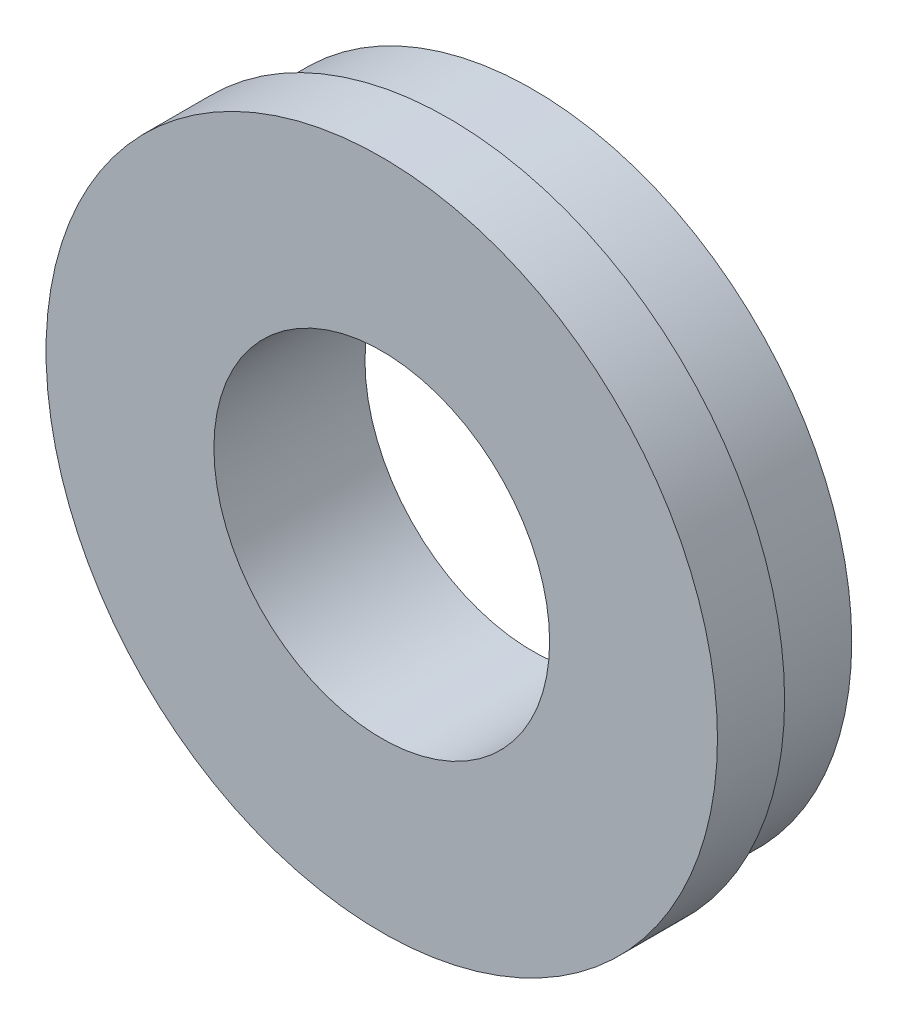
ISO-10303-21;
HEADER;
FILE_DESCRIPTION(('STEP AP214'),'2;1');
FILE_NAME('part.step','',(''),(''),'','','');
FILE_SCHEMA(('AUTOMOTIVE_DESIGN { 1 0 10303 214 1 1 1 1 }'));
ENDSEC;
DATA;
#1=APPLICATION_CONTEXT('core data for automotive mechanical design processes');
#2=APPLICATION_PROTOCOL_DEFINITION('international standard','automotive_design',2000,#1);
#3=PRODUCT_CONTEXT('',#1,'mechanical');
#4=PRODUCT('Part','Part','',(#3));
#5=PRODUCT_RELATED_PRODUCT_CATEGORY('part','',(#4));
#6=PRODUCT_DEFINITION_FORMATION('','',#4);
#7=PRODUCT_DEFINITION_CONTEXT('part definition',#1,'design');
#8=PRODUCT_DEFINITION('design','',#6,#7);
#9=PRODUCT_DEFINITION_SHAPE('','',#8);
#10=(LENGTH_UNIT() NAMED_UNIT(*) SI_UNIT(.MILLI.,.METRE.));
#11=(NAMED_UNIT(*) PLANE_ANGLE_UNIT() SI_UNIT($,.RADIAN.));
#12=(NAMED_UNIT(*) SI_UNIT($,.STERADIAN.) SOLID_ANGLE_UNIT());
#13=UNCERTAINTY_MEASURE_WITH_UNIT(LENGTH_MEASURE(1.E-05),#10,'distance_accuracy_value','');
#14=(GEOMETRIC_REPRESENTATION_CONTEXT(3) GLOBAL_UNCERTAINTY_ASSIGNED_CONTEXT((#13)) GLOBAL_UNIT_ASSIGNED_CONTEXT((#10,
#11,#12)) REPRESENTATION_CONTEXT('',''));
#15=CARTESIAN_POINT('',(0.,0.,0.));
#16=DIRECTION('',(0.,0.,1.));
#17=DIRECTION('',(1.,0.,0.));
#18=AXIS2_PLACEMENT_3D('',#15,#16,#17);
#19=CARTESIAN_POINT('',(0.,0.,0.));
#20=DIRECTION('',(0.,0.,-1.));
#21=DIRECTION('',(-1.,0.,0.));
#22=AXIS2_PLACEMENT_3D('',#19,#20,#21);
#23=PLANE('',#22);
#24=CARTESIAN_POINT('',(0.,0.,0.));
#25=DIRECTION('',(0.,0.,1.));
#26=DIRECTION('',(1.,0.,0.));
#27=AXIS2_PLACEMENT_3D('',#24,#25,#26);
#28=CIRCLE('',#27,4.);
#29=CARTESIAN_POINT('',(4.,0.,0.));
#30=VERTEX_POINT('',#29);
#31=EDGE_CURVE('E10',#30,#30,#28,.T.);
#32=ORIENTED_EDGE('',*,*,#31,.T.);
#33=EDGE_LOOP('',(#32));
#34=FACE_BOUND('',#33,.T.);
#35=CARTESIAN_POINT('',(0.,0.,0.));
#36=DIRECTION('',(0.,0.,1.));
#37=DIRECTION('',(1.,0.,0.));
#38=AXIS2_PLACEMENT_3D('',#35,#36,#37);
#39=CIRCLE('',#38,2.);
#40=CARTESIAN_POINT('',(2.,0.,0.));
#41=VERTEX_POINT('',#40);
#42=EDGE_CURVE('E50',#41,#41,#39,.T.);
#43=ORIENTED_EDGE('',*,*,#42,.F.);
#44=EDGE_LOOP('',(#43));
#45=FACE_BOUND('',#44,.T.);
#46=ADVANCED_FACE('F31',(#34,#45),#23,.F.);
#47=CARTESIAN_POINT('',(0.,3.8,-1.8));
#48=DIRECTION('',(0.,0.,1.));
#49=DIRECTION('',(1.,0.,0.));
#50=AXIS2_PLACEMENT_3D('',#47,#48,#49);
#51=PLANE('',#50);
#52=CARTESIAN_POINT('',(0.,0.,-1.8));
#53=DIRECTION('',(0.,0.,1.));
#54=DIRECTION('',(1.,0.,0.));
#55=AXIS2_PLACEMENT_3D('',#52,#53,#54);
#56=CIRCLE('',#55,3.8);
#57=CARTESIAN_POINT('',(3.8,0.,-1.8));
#58=VERTEX_POINT('',#57);
#59=EDGE_CURVE('E45',#58,#58,#56,.T.);
#60=ORIENTED_EDGE('',*,*,#59,.F.);
#61=EDGE_LOOP('',(#60));
#62=FACE_BOUND('',#61,.T.);
#63=CARTESIAN_POINT('',(0.,0.,-1.8));
#64=DIRECTION('',(0.,0.,1.));
#65=DIRECTION('',(1.,0.,0.));
#66=AXIS2_PLACEMENT_3D('',#63,#64,#65);
#67=CIRCLE('',#66,2.);
#68=CARTESIAN_POINT('',(2.,0.,-1.8));
#69=VERTEX_POINT('',#68);
#70=EDGE_CURVE('E53',#69,#69,#67,.T.);
#71=ORIENTED_EDGE('',*,*,#70,.T.);
#72=EDGE_LOOP('',(#71));
#73=FACE_BOUND('',#72,.T.);
#74=ADVANCED_FACE('F57',(#62,#73),#51,.F.);
#75=CARTESIAN_POINT('',(0.,0.,-1.8));
#76=DIRECTION('',(0.,0.,1.));
#77=DIRECTION('',(1.,0.,0.));
#78=AXIS2_PLACEMENT_3D('',#75,#76,#77);
#79=CYLINDRICAL_SURFACE('',#78,4.);
#80=ORIENTED_EDGE('',*,*,#31,.F.);
#81=EDGE_LOOP('',(#80));
#82=FACE_BOUND('',#81,.T.);
#83=CARTESIAN_POINT('',(0.,0.,-0.8));
#84=DIRECTION('',(0.,0.,1.));
#85=DIRECTION('',(1.,0.,0.));
#86=AXIS2_PLACEMENT_3D('',#83,#84,#85);
#87=CIRCLE('',#86,4.);
#88=CARTESIAN_POINT('',(4.,0.,-0.8));
#89=VERTEX_POINT('',#88);
#90=EDGE_CURVE('E37',#89,#89,#87,.T.);
#91=ORIENTED_EDGE('',*,*,#90,.T.);
#92=EDGE_LOOP('',(#91));
#93=FACE_BOUND('',#92,.T.);
#94=ADVANCED_FACE('F75',(#82,#93),#79,.T.);
#95=CARTESIAN_POINT('',(0.,4.,-0.8));
#96=DIRECTION('',(0.,0.,1.));
#97=DIRECTION('',(1.,0.,0.));
#98=AXIS2_PLACEMENT_3D('',#95,#96,#97);
#99=PLANE('',#98);
#100=ORIENTED_EDGE('',*,*,#90,.F.);
#101=EDGE_LOOP('',(#100));
#102=FACE_BOUND('',#101,.T.);
#103=CARTESIAN_POINT('',(0.,0.,-0.8));
#104=DIRECTION('',(0.,0.,1.));
#105=DIRECTION('',(1.,0.,0.));
#106=AXIS2_PLACEMENT_3D('',#103,#104,#105);
#107=CIRCLE('',#106,3.8);
#108=CARTESIAN_POINT('',(3.8,0.,-0.8));
#109=VERTEX_POINT('',#108);
#110=EDGE_CURVE('E41',#109,#109,#107,.T.);
#111=ORIENTED_EDGE('',*,*,#110,.T.);
#112=EDGE_LOOP('',(#111));
#113=FACE_BOUND('',#112,.T.);
#114=ADVANCED_FACE('F67',(#102,#113),#99,.F.);
#115=CARTESIAN_POINT('',(0.,0.,-1.8));
#116=DIRECTION('',(0.,0.,1.));
#117=DIRECTION('',(1.,0.,0.));
#118=AXIS2_PLACEMENT_3D('',#115,#116,#117);
#119=CYLINDRICAL_SURFACE('',#118,3.8);
#120=ORIENTED_EDGE('',*,*,#110,.F.);
#121=EDGE_LOOP('',(#120));
#122=FACE_BOUND('',#121,.T.);
#123=ORIENTED_EDGE('',*,*,#59,.T.);
#124=EDGE_LOOP('',(#123));
#125=FACE_BOUND('',#124,.T.);
#126=ADVANCED_FACE('F61',(#122,#125),#119,.T.);
#127=CARTESIAN_POINT('',(0.,0.,-1.8));
#128=DIRECTION('',(0.,0.,1.));
#129=DIRECTION('',(1.,0.,0.));
#130=AXIS2_PLACEMENT_3D('',#127,#128,#129);
#131=CYLINDRICAL_SURFACE('',#130,2.);
#132=ORIENTED_EDGE('',*,*,#42,.T.);
#133=EDGE_LOOP('',(#132));
#134=FACE_BOUND('',#133,.T.);
#135=ORIENTED_EDGE('',*,*,#70,.F.);
#136=EDGE_LOOP('',(#135));
#137=FACE_BOUND('',#136,.T.);
#138=ADVANCED_FACE('F59',(#134,#137),#131,.F.);
#139=CLOSED_SHELL('',(#46,#74,#94,#114,#126,#138));
#140=MANIFOLD_SOLID_BREP('B2',#139);
#141=ADVANCED_BREP_SHAPE_REPRESENTATION('',(#18,#140),#14);
#142=SHAPE_DEFINITION_REPRESENTATION(#9,#141);
ENDSEC;
END-ISO-10303-21;
